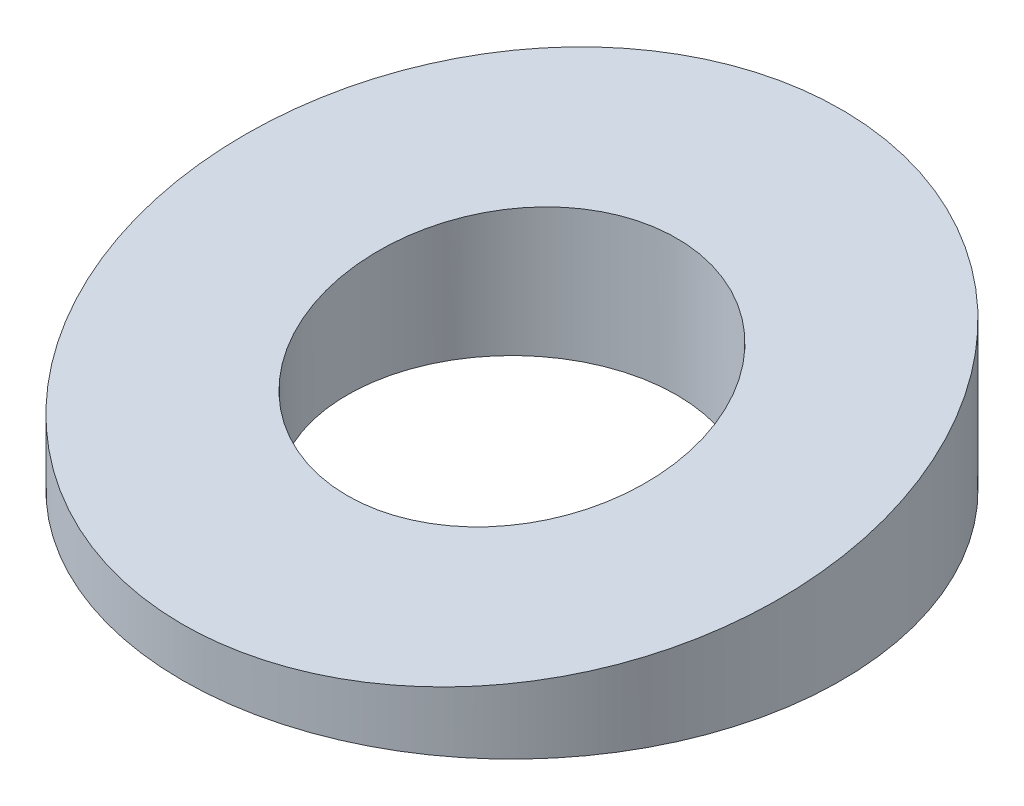
ISO-10303-21;
HEADER;
FILE_DESCRIPTION(('STEP AP214'),'2;1');
FILE_NAME('part.step','',(''),(''),'','','');
FILE_SCHEMA(('AUTOMOTIVE_DESIGN { 1 0 10303 214 1 1 1 1 }'));
ENDSEC;
DATA;
#1=APPLICATION_CONTEXT('core data for automotive mechanical design processes');
#2=APPLICATION_PROTOCOL_DEFINITION('international standard','automotive_design',2000,#1);
#3=PRODUCT_CONTEXT('',#1,'mechanical');
#4=PRODUCT('Part','Part','',(#3));
#5=PRODUCT_RELATED_PRODUCT_CATEGORY('part','',(#4));
#6=PRODUCT_DEFINITION_FORMATION('','',#4);
#7=PRODUCT_DEFINITION_CONTEXT('part definition',#1,'design');
#8=PRODUCT_DEFINITION('design','',#6,#7);
#9=PRODUCT_DEFINITION_SHAPE('','',#8);
#10=(LENGTH_UNIT() NAMED_UNIT(*) SI_UNIT(.MILLI.,.METRE.));
#11=(NAMED_UNIT(*) PLANE_ANGLE_UNIT() SI_UNIT($,.RADIAN.));
#12=(NAMED_UNIT(*) SI_UNIT($,.STERADIAN.) SOLID_ANGLE_UNIT());
#13=UNCERTAINTY_MEASURE_WITH_UNIT(LENGTH_MEASURE(1.E-05),#10,'distance_accuracy_value','');
#14=(GEOMETRIC_REPRESENTATION_CONTEXT(3) GLOBAL_UNCERTAINTY_ASSIGNED_CONTEXT((#13)) GLOBAL_UNIT_ASSIGNED_CONTEXT((#10,
#11,#12)) REPRESENTATION_CONTEXT('',''));
#15=CARTESIAN_POINT('',(0.,0.,0.));
#16=DIRECTION('',(0.,0.,1.));
#17=DIRECTION('',(1.,0.,0.));
#18=AXIS2_PLACEMENT_3D('',#15,#16,#17);
#19=CARTESIAN_POINT('',(0.,0.,0.));
#20=DIRECTION('',(0.,1.,0.));
#21=DIRECTION('',(0.,0.,1.));
#22=AXIS2_PLACEMENT_3D('',#19,#20,#21);
#23=PLANE('',#22);
#24=CARTESIAN_POINT('',(0.,0.,0.));
#25=DIRECTION('',(0.,1.,0.));
#26=DIRECTION('',(0.,0.,1.));
#27=AXIS2_PLACEMENT_3D('',#24,#25,#26);
#28=CIRCLE('',#27,4.);
#29=CARTESIAN_POINT('',(0.,0.,4.));
#30=VERTEX_POINT('',#29);
#31=EDGE_CURVE('E10',#30,#30,#28,.T.);
#32=ORIENTED_EDGE('',*,*,#31,.F.);
#33=EDGE_LOOP('',(#32));
#34=FACE_BOUND('',#33,.T.);
#35=CARTESIAN_POINT('',(0.,0.,0.));
#36=DIRECTION('',(0.,1.,0.));
#37=DIRECTION('',(0.,0.,1.));
#38=AXIS2_PLACEMENT_3D('',#35,#36,#37);
#39=CIRCLE('',#38,2.);
#40=CARTESIAN_POINT('',(0.,0.,2.));
#41=VERTEX_POINT('',#40);
#42=EDGE_CURVE('E46',#41,#41,#39,.T.);
#43=ORIENTED_EDGE('',*,*,#42,.T.);
#44=EDGE_LOOP('',(#43));
#45=FACE_BOUND('',#44,.T.);
#46=ADVANCED_FACE('F37',(#34,#45),#23,.F.);
#47=CARTESIAN_POINT('',(0.,2.,0.));
#48=DIRECTION('',(0.,-1.,0.));
#49=DIRECTION('',(0.,0.,-1.));
#50=AXIS2_PLACEMENT_3D('',#47,#48,#49);
#51=CYLINDRICAL_SURFACE('',#50,4.);
#52=CARTESIAN_POINT('',(0.,1.29469207716614,0.));
#53=DIRECTION('',(0.,-0.984807753012208,-0.173648177666931));
#54=DIRECTION('',(0.,-0.173648177666931,0.984807753012208));
#55=AXIS2_PLACEMENT_3D('',#52,#53,#54);
#56=ELLIPSE('',#55,4.06170644754298,4.);
#57=CARTESIAN_POINT('',(0.,0.589384154332273,4.));
#58=VERTEX_POINT('',#57);
#59=EDGE_CURVE('E51',#58,#58,#56,.T.);
#60=ORIENTED_EDGE('',*,*,#59,.T.);
#61=EDGE_LOOP('',(#60));
#62=FACE_BOUND('',#61,.T.);
#63=ORIENTED_EDGE('',*,*,#31,.T.);
#64=EDGE_LOOP('',(#63));
#65=FACE_BOUND('',#64,.T.);
#66=ADVANCED_FACE('F39',(#62,#65),#51,.T.);
#67=CARTESIAN_POINT('',(0.,2.,0.));
#68=DIRECTION('',(0.,-1.,0.));
#69=DIRECTION('',(0.,0.,-1.));
#70=AXIS2_PLACEMENT_3D('',#67,#68,#69);
#71=CYLINDRICAL_SURFACE('',#70,2.);
#72=CARTESIAN_POINT('',(0.,1.29469207716614,0.));
#73=DIRECTION('',(0.,-0.984807753012208,-0.173648177666931));
#74=DIRECTION('',(0.,-0.173648177666931,0.984807753012208));
#75=AXIS2_PLACEMENT_3D('',#72,#73,#74);
#76=ELLIPSE('',#75,2.03085322377149,2.);
#77=CARTESIAN_POINT('',(0.,0.942038115749205,2.));
#78=VERTEX_POINT('',#77);
#79=EDGE_CURVE('E41',#78,#78,#76,.T.);
#80=ORIENTED_EDGE('',*,*,#79,.F.);
#81=EDGE_LOOP('',(#80));
#82=FACE_BOUND('',#81,.T.);
#83=ORIENTED_EDGE('',*,*,#42,.F.);
#84=EDGE_LOOP('',(#83));
#85=FACE_BOUND('',#84,.T.);
#86=ADVANCED_FACE('F65',(#82,#85),#71,.F.);
#87=CARTESIAN_POINT('',(10.,1.25565233413457,0.221405384897486));
#88=DIRECTION('',(0.,-0.984807753012208,-0.173648177666931));
#89=DIRECTION('',(0.,0.173648177666931,-0.984807753012208));
#90=AXIS2_PLACEMENT_3D('',#87,#88,#89);
#91=PLANE('',#90);
#92=ORIENTED_EDGE('',*,*,#79,.T.);
#93=EDGE_LOOP('',(#92));
#94=FACE_BOUND('',#93,.T.);
#95=ORIENTED_EDGE('',*,*,#59,.F.);
#96=EDGE_LOOP('',(#95));
#97=FACE_BOUND('',#96,.T.);
#98=ADVANCED_FACE('F62',(#94,#97),#91,.F.);
#99=CLOSED_SHELL('',(#46,#66,#86,#98));
#100=MANIFOLD_SOLID_BREP('B2',#99);
#101=ADVANCED_BREP_SHAPE_REPRESENTATION('',(#18,#100),#14);
#102=SHAPE_DEFINITION_REPRESENTATION(#9,#101);
ENDSEC;
END-ISO-10303-21;
